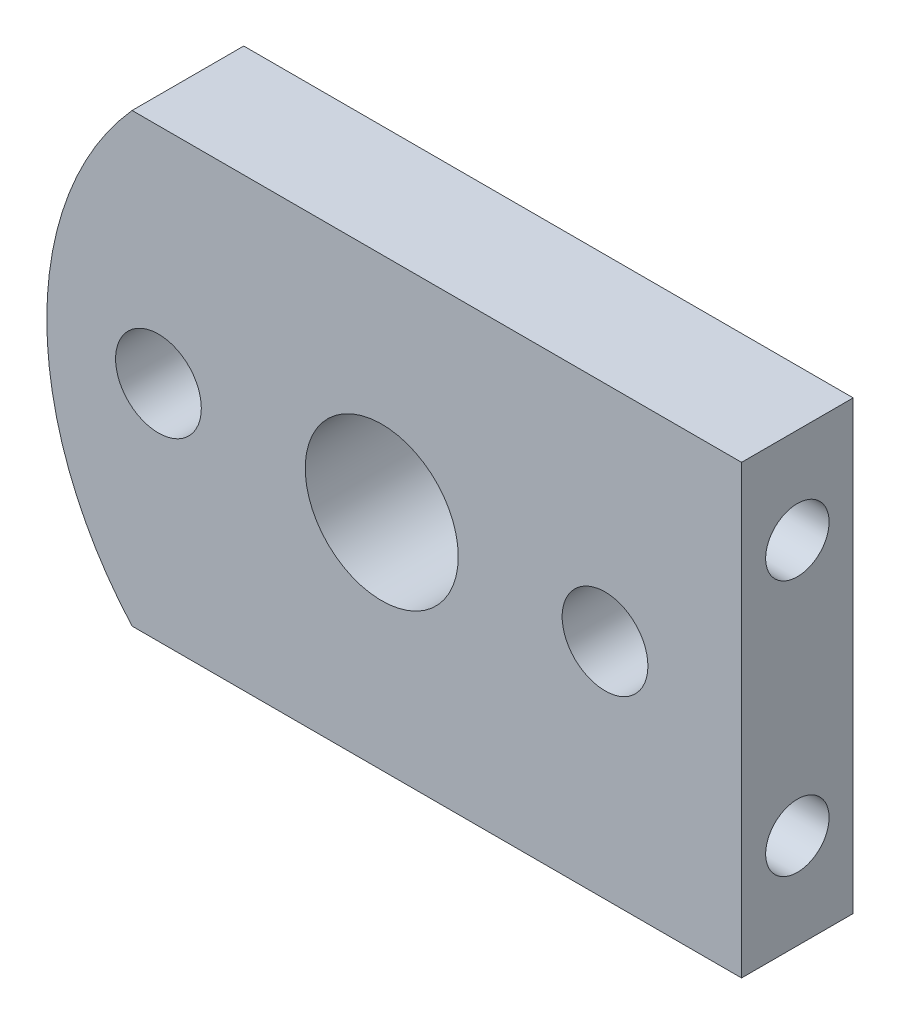
ISO-10303-21;
HEADER;
FILE_DESCRIPTION(('STEP AP214'),'2;1');
FILE_NAME('part.step','',(''),(''),'','','');
FILE_SCHEMA(('AUTOMOTIVE_DESIGN { 1 0 10303 214 1 1 1 1 }'));
ENDSEC;
DATA;
#1=APPLICATION_CONTEXT('core data for automotive mechanical design processes');
#2=APPLICATION_PROTOCOL_DEFINITION('international standard','automotive_design',2000,#1);
#3=PRODUCT_CONTEXT('',#1,'mechanical');
#4=PRODUCT('Part','Part','',(#3));
#5=PRODUCT_RELATED_PRODUCT_CATEGORY('part','',(#4));
#6=PRODUCT_DEFINITION_FORMATION('','',#4);
#7=PRODUCT_DEFINITION_CONTEXT('part definition',#1,'design');
#8=PRODUCT_DEFINITION('design','',#6,#7);
#9=PRODUCT_DEFINITION_SHAPE('','',#8);
#10=(LENGTH_UNIT() NAMED_UNIT(*) SI_UNIT(.MILLI.,.METRE.));
#11=(NAMED_UNIT(*) PLANE_ANGLE_UNIT() SI_UNIT($,.RADIAN.));
#12=(NAMED_UNIT(*) SI_UNIT($,.STERADIAN.) SOLID_ANGLE_UNIT());
#13=UNCERTAINTY_MEASURE_WITH_UNIT(LENGTH_MEASURE(1.E-05),#10,'distance_accuracy_value','');
#14=(GEOMETRIC_REPRESENTATION_CONTEXT(3) GLOBAL_UNCERTAINTY_ASSIGNED_CONTEXT((#13)) GLOBAL_UNIT_ASSIGNED_CONTEXT((#10,
#11,#12)) REPRESENTATION_CONTEXT('',''));
#15=CARTESIAN_POINT('',(0.,0.,0.));
#16=DIRECTION('',(0.,0.,1.));
#17=DIRECTION('',(1.,0.,0.));
#18=AXIS2_PLACEMENT_3D('',#15,#16,#17);
#19=CARTESIAN_POINT('',(44.45,0.,4.7625));
#20=DIRECTION('',(-1.,0.,0.));
#21=DIRECTION('',(0.,0.,1.));
#22=AXIS2_PLACEMENT_3D('',#19,#20,#21);
#23=PLANE('',#22);
#24=CARTESIAN_POINT('',(44.45,15.7733999999998,2.38125));
#25=DIRECTION('',(1.,0.,0.));
#26=DIRECTION('',(0.,0.,-1.));
#27=AXIS2_PLACEMENT_3D('',#24,#25,#26);
#28=CIRCLE('',#27,1.35254999999999);
#29=CARTESIAN_POINT('',(44.45,15.7733999999998,1.02870000000001));
#30=VERTEX_POINT('',#29);
#31=EDGE_CURVE('E96',#30,#30,#28,.T.);
#32=ORIENTED_EDGE('',*,*,#31,.F.);
#33=EDGE_LOOP('',(#32));
#34=FACE_BOUND('',#33,.T.);
#35=CARTESIAN_POINT('',(44.45,4.85139999999978,2.38125));
#36=DIRECTION('',(1.,0.,0.));
#37=DIRECTION('',(0.,0.,-1.));
#38=AXIS2_PLACEMENT_3D('',#35,#36,#37);
#39=CIRCLE('',#38,1.35254999999999);
#40=CARTESIAN_POINT('',(44.45,4.85139999999978,1.02870000000001));
#41=VERTEX_POINT('',#40);
#42=EDGE_CURVE('E95',#41,#41,#39,.T.);
#43=ORIENTED_EDGE('',*,*,#42,.F.);
#44=EDGE_LOOP('',(#43));
#45=FACE_BOUND('',#44,.T.);
#46=DIRECTION('',(0.,1.,0.));
#47=VECTOR('',#46,1.);
#48=CARTESIAN_POINT('',(44.45,0.,0.));
#49=LINE('',#48,#47);
#50=CARTESIAN_POINT('',(44.45,0.787399999999777,0.));
#51=VERTEX_POINT('',#50);
#52=CARTESIAN_POINT('',(44.45,19.8373999999998,0.));
#53=VERTEX_POINT('',#52);
#54=EDGE_CURVE('E37',#51,#53,#49,.T.);
#55=ORIENTED_EDGE('',*,*,#54,.T.);
#56=DIRECTION('',(0.,0.,1.));
#57=VECTOR('',#56,1.);
#58=CARTESIAN_POINT('',(44.45,19.8373999999998,0.));
#59=LINE('',#58,#57);
#60=CARTESIAN_POINT('',(44.45,19.8373999999998,4.7625));
#61=VERTEX_POINT('',#60);
#62=EDGE_CURVE('E57',#53,#61,#59,.T.);
#63=ORIENTED_EDGE('',*,*,#62,.T.);
#64=DIRECTION('',(0.,1.,0.));
#65=VECTOR('',#64,1.);
#66=CARTESIAN_POINT('',(44.45,0.,4.7625));
#67=LINE('',#66,#65);
#68=CARTESIAN_POINT('',(44.45,0.787399999999777,4.7625));
#69=VERTEX_POINT('',#68);
#70=EDGE_CURVE('E11',#69,#61,#67,.T.);
#71=ORIENTED_EDGE('',*,*,#70,.F.);
#72=DIRECTION('',(0.,0.,1.));
#73=VECTOR('',#72,1.);
#74=CARTESIAN_POINT('',(44.45,0.787399999999777,0.));
#75=LINE('',#74,#73);
#76=EDGE_CURVE('E111',#51,#69,#75,.T.);
#77=ORIENTED_EDGE('',*,*,#76,.F.);
#78=EDGE_LOOP('',(#55,#63,#71,#77));
#79=FACE_BOUND('',#78,.T.);
#80=ADVANCED_FACE('F34',(#34,#45,#79),#23,.F.);
#81=CARTESIAN_POINT('',(0.,0.,4.7625));
#82=DIRECTION('',(0.,0.,-1.));
#83=DIRECTION('',(-1.,0.,0.));
#84=AXIS2_PLACEMENT_3D('',#81,#82,#83);
#85=PLANE('',#84);
#86=CARTESIAN_POINT('',(38.6265,10.3123999999998,4.7625));
#87=DIRECTION('',(0.,0.,1.));
#88=DIRECTION('',(1.,0.,0.));
#89=AXIS2_PLACEMENT_3D('',#86,#87,#88);
#90=CIRCLE('',#89,1.8288);
#91=CARTESIAN_POINT('',(40.4553,10.3123999999998,4.7625));
#92=VERTEX_POINT('',#91);
#93=EDGE_CURVE('E119',#92,#92,#90,.T.);
#94=ORIENTED_EDGE('',*,*,#93,.F.);
#95=EDGE_LOOP('',(#94));
#96=FACE_BOUND('',#95,.T.);
#97=CARTESIAN_POINT('',(19.5765,10.3123999999998,4.7625));
#98=DIRECTION('',(0.,0.,1.));
#99=DIRECTION('',(1.,0.,0.));
#100=AXIS2_PLACEMENT_3D('',#97,#98,#99);
#101=CIRCLE('',#100,1.8288);
#102=CARTESIAN_POINT('',(21.4053,10.3123999999998,4.7625));
#103=VERTEX_POINT('',#102);
#104=EDGE_CURVE('E130',#103,#103,#101,.T.);
#105=ORIENTED_EDGE('',*,*,#104,.F.);
#106=EDGE_LOOP('',(#105));
#107=FACE_BOUND('',#106,.T.);
#108=CARTESIAN_POINT('',(29.1015,10.3123999999998,4.7625));
#109=DIRECTION('',(0.,0.,1.));
#110=DIRECTION('',(1.,0.,0.));
#111=AXIS2_PLACEMENT_3D('',#108,#109,#110);
#112=CIRCLE('',#111,3.2639);
#113=CARTESIAN_POINT('',(32.3654,10.3123999999998,4.7625));
#114=VERTEX_POINT('',#113);
#115=EDGE_CURVE('E136',#114,#114,#112,.T.);
#116=ORIENTED_EDGE('',*,*,#115,.F.);
#117=EDGE_LOOP('',(#116));
#118=FACE_BOUND('',#117,.T.);
#119=ORIENTED_EDGE('',*,*,#70,.T.);
#120=DIRECTION('',(1.,0.,0.));
#121=VECTOR('',#120,1.);
#122=CARTESIAN_POINT('',(18.4522262571573,19.8373999999998,4.7625));
#123=LINE('',#122,#121);
#124=CARTESIAN_POINT('',(18.4522262571573,19.8373999999998,4.7625));
#125=VERTEX_POINT('',#124);
#126=EDGE_CURVE('E73',#125,#61,#123,.T.);
#127=ORIENTED_EDGE('',*,*,#126,.F.);
#128=CARTESIAN_POINT('',(29.1015,10.3123999999998,4.7625));
#129=DIRECTION('',(0.,0.,-1.));
#130=DIRECTION('',(1.,0.,0.));
#131=AXIS2_PLACEMENT_3D('',#128,#129,#130);
#132=CIRCLE('',#131,14.2875);
#133=CARTESIAN_POINT('',(18.4522262571573,0.787399999999778,4.7625));
#134=VERTEX_POINT('',#133);
#135=EDGE_CURVE('E114',#134,#125,#132,.T.);
#136=ORIENTED_EDGE('',*,*,#135,.F.);
#137=DIRECTION('',(-1.,0.,0.));
#138=VECTOR('',#137,1.);
#139=CARTESIAN_POINT('',(18.4522262571573,0.787399999999776,4.7625));
#140=LINE('',#139,#138);
#141=EDGE_CURVE('E106',#69,#134,#140,.T.);
#142=ORIENTED_EDGE('',*,*,#141,.F.);
#143=EDGE_LOOP('',(#119,#127,#136,#142));
#144=FACE_BOUND('',#143,.T.);
#145=ADVANCED_FACE('F155',(#96,#107,#118,#144),#85,.F.);
#146=CARTESIAN_POINT('',(0.,0.,0.));
#147=DIRECTION('',(0.,0.,-1.));
#148=DIRECTION('',(-1.,0.,0.));
#149=AXIS2_PLACEMENT_3D('',#146,#147,#148);
#150=PLANE('',#149);
#151=DIRECTION('',(1.,0.,0.));
#152=VECTOR('',#151,1.);
#153=CARTESIAN_POINT('',(18.4522262571573,19.8373999999998,0.));
#154=LINE('',#153,#152);
#155=CARTESIAN_POINT('',(18.4522262571573,19.8373999999998,0.));
#156=VERTEX_POINT('',#155);
#157=EDGE_CURVE('E109',#156,#53,#154,.T.);
#158=ORIENTED_EDGE('',*,*,#157,.T.);
#159=ORIENTED_EDGE('',*,*,#54,.F.);
#160=DIRECTION('',(-1.,0.,0.));
#161=VECTOR('',#160,1.);
#162=CARTESIAN_POINT('',(18.4522262571573,0.787399999999776,0.));
#163=LINE('',#162,#161);
#164=CARTESIAN_POINT('',(18.4522262571573,0.787399999999776,0.));
#165=VERTEX_POINT('',#164);
#166=EDGE_CURVE('E77',#51,#165,#163,.T.);
#167=ORIENTED_EDGE('',*,*,#166,.T.);
#168=CARTESIAN_POINT('',(29.1015,10.3123999999998,0.));
#169=DIRECTION('',(0.,0.,-1.));
#170=DIRECTION('',(1.,0.,0.));
#171=AXIS2_PLACEMENT_3D('',#168,#169,#170);
#172=CIRCLE('',#171,14.2875);
#173=EDGE_CURVE('E48',#165,#156,#172,.T.);
#174=ORIENTED_EDGE('',*,*,#173,.T.);
#175=EDGE_LOOP('',(#158,#159,#167,#174));
#176=FACE_BOUND('',#175,.T.);
#177=CARTESIAN_POINT('',(38.6265,10.3123999999998,0.));
#178=DIRECTION('',(0.,0.,1.));
#179=DIRECTION('',(1.,0.,0.));
#180=AXIS2_PLACEMENT_3D('',#177,#178,#179);
#181=CIRCLE('',#180,1.8288);
#182=CARTESIAN_POINT('',(40.4553,10.3123999999998,0.));
#183=VERTEX_POINT('',#182);
#184=EDGE_CURVE('E127',#183,#183,#181,.T.);
#185=ORIENTED_EDGE('',*,*,#184,.T.);
#186=EDGE_LOOP('',(#185));
#187=FACE_BOUND('',#186,.T.);
#188=CARTESIAN_POINT('',(19.5765,10.3123999999998,0.));
#189=DIRECTION('',(0.,0.,1.));
#190=DIRECTION('',(1.,0.,0.));
#191=AXIS2_PLACEMENT_3D('',#188,#189,#190);
#192=CIRCLE('',#191,1.8288);
#193=CARTESIAN_POINT('',(21.4053,10.3123999999998,0.));
#194=VERTEX_POINT('',#193);
#195=EDGE_CURVE('E133',#194,#194,#192,.T.);
#196=ORIENTED_EDGE('',*,*,#195,.T.);
#197=EDGE_LOOP('',(#196));
#198=FACE_BOUND('',#197,.T.);
#199=CARTESIAN_POINT('',(29.1015,10.3123999999998,0.));
#200=DIRECTION('',(0.,0.,1.));
#201=DIRECTION('',(1.,0.,0.));
#202=AXIS2_PLACEMENT_3D('',#199,#200,#201);
#203=CIRCLE('',#202,3.2639);
#204=CARTESIAN_POINT('',(32.3654,10.3123999999998,0.));
#205=VERTEX_POINT('',#204);
#206=EDGE_CURVE('E139',#205,#205,#203,.T.);
#207=ORIENTED_EDGE('',*,*,#206,.T.);
#208=EDGE_LOOP('',(#207));
#209=FACE_BOUND('',#208,.T.);
#210=ADVANCED_FACE('F148',(#176,#187,#198,#209),#150,.T.);
#211=CARTESIAN_POINT('',(29.1015,10.3123999999998,4.7625));
#212=DIRECTION('',(0.,0.,1.));
#213=DIRECTION('',(1.,0.,0.));
#214=AXIS2_PLACEMENT_3D('',#211,#212,#213);
#215=CYLINDRICAL_SURFACE('',#214,3.2639);
#216=ORIENTED_EDGE('',*,*,#206,.F.);
#217=EDGE_LOOP('',(#216));
#218=FACE_BOUND('',#217,.T.);
#219=ORIENTED_EDGE('',*,*,#115,.T.);
#220=EDGE_LOOP('',(#219));
#221=FACE_BOUND('',#220,.T.);
#222=ADVANCED_FACE('F200',(#218,#221),#215,.F.);
#223=CARTESIAN_POINT('',(19.5765,10.3123999999998,4.7625));
#224=DIRECTION('',(0.,0.,1.));
#225=DIRECTION('',(1.,0.,0.));
#226=AXIS2_PLACEMENT_3D('',#223,#224,#225);
#227=CYLINDRICAL_SURFACE('',#226,1.8288);
#228=ORIENTED_EDGE('',*,*,#195,.F.);
#229=EDGE_LOOP('',(#228));
#230=FACE_BOUND('',#229,.T.);
#231=ORIENTED_EDGE('',*,*,#104,.T.);
#232=EDGE_LOOP('',(#231));
#233=FACE_BOUND('',#232,.T.);
#234=ADVANCED_FACE('F195',(#230,#233),#227,.F.);
#235=CARTESIAN_POINT('',(38.6265,10.3123999999998,4.7625));
#236=DIRECTION('',(0.,0.,1.));
#237=DIRECTION('',(1.,0.,0.));
#238=AXIS2_PLACEMENT_3D('',#235,#236,#237);
#239=CYLINDRICAL_SURFACE('',#238,1.8288);
#240=ORIENTED_EDGE('',*,*,#184,.F.);
#241=EDGE_LOOP('',(#240));
#242=FACE_BOUND('',#241,.T.);
#243=ORIENTED_EDGE('',*,*,#93,.T.);
#244=EDGE_LOOP('',(#243));
#245=FACE_BOUND('',#244,.T.);
#246=ADVANCED_FACE('F191',(#242,#245),#239,.F.);
#247=CARTESIAN_POINT('',(18.4522262571573,19.8373999999998,0.));
#248=DIRECTION('',(0.,-1.,0.));
#249=DIRECTION('',(0.,0.,-1.));
#250=AXIS2_PLACEMENT_3D('',#247,#248,#249);
#251=PLANE('',#250);
#252=ORIENTED_EDGE('',*,*,#126,.T.);
#253=ORIENTED_EDGE('',*,*,#62,.F.);
#254=ORIENTED_EDGE('',*,*,#157,.F.);
#255=DIRECTION('',(0.,0.,1.));
#256=VECTOR('',#255,1.);
#257=CARTESIAN_POINT('',(18.4522262571573,19.8373999999998,0.));
#258=LINE('',#257,#256);
#259=EDGE_CURVE('E120',#156,#125,#258,.T.);
#260=ORIENTED_EDGE('',*,*,#259,.T.);
#261=EDGE_LOOP('',(#252,#253,#254,#260));
#262=FACE_BOUND('',#261,.T.);
#263=ADVANCED_FACE('F150',(#262),#251,.F.);
#264=CARTESIAN_POINT('',(29.1015,10.3123999999998,0.));
#265=DIRECTION('',(0.,0.,1.));
#266=DIRECTION('',(1.,0.,0.));
#267=AXIS2_PLACEMENT_3D('',#264,#265,#266);
#268=CYLINDRICAL_SURFACE('',#267,14.2875);
#269=ORIENTED_EDGE('',*,*,#135,.T.);
#270=ORIENTED_EDGE('',*,*,#259,.F.);
#271=ORIENTED_EDGE('',*,*,#173,.F.);
#272=DIRECTION('',(0.,0.,1.));
#273=VECTOR('',#272,1.);
#274=CARTESIAN_POINT('',(18.4522262571573,0.787399999999778,0.));
#275=LINE('',#274,#273);
#276=EDGE_CURVE('E122',#165,#134,#275,.T.);
#277=ORIENTED_EDGE('',*,*,#276,.T.);
#278=EDGE_LOOP('',(#269,#270,#271,#277));
#279=FACE_BOUND('',#278,.T.);
#280=ADVANCED_FACE('F152',(#279),#268,.T.);
#281=CARTESIAN_POINT('',(18.4522262571573,0.787399999999776,0.));
#282=DIRECTION('',(0.,1.,0.));
#283=DIRECTION('',(-1.,0.,0.));
#284=AXIS2_PLACEMENT_3D('',#281,#282,#283);
#285=PLANE('',#284);
#286=ORIENTED_EDGE('',*,*,#141,.T.);
#287=ORIENTED_EDGE('',*,*,#276,.F.);
#288=ORIENTED_EDGE('',*,*,#166,.F.);
#289=ORIENTED_EDGE('',*,*,#76,.T.);
#290=EDGE_LOOP('',(#286,#287,#288,#289));
#291=FACE_BOUND('',#290,.T.);
#292=ADVANCED_FACE('F156',(#291),#285,.F.);
#293=CARTESIAN_POINT('',(31.75,4.85139999999978,2.38125));
#294=DIRECTION('',(1.,0.,0.));
#295=DIRECTION('',(0.,0.,-1.));
#296=AXIS2_PLACEMENT_3D('',#293,#294,#295);
#297=CONICAL_SURFACE('',#296,1.35255,1.02974425867665);
#298=CARTESIAN_POINT('',(30.9373059697343,4.85139999999977,2.38125));
#299=VERTEX_POINT('',#298);
#300=VERTEX_LOOP('',#299);
#301=FACE_BOUND('',#300,.T.);
#302=CARTESIAN_POINT('',(31.75,4.85139999999978,2.38125));
#303=DIRECTION('',(1.,0.,0.));
#304=DIRECTION('',(0.,0.,-1.));
#305=AXIS2_PLACEMENT_3D('',#302,#303,#304);
#306=CIRCLE('',#305,1.35255);
#307=CARTESIAN_POINT('',(31.75,4.85139999999978,1.0287));
#308=VERTEX_POINT('',#307);
#309=EDGE_CURVE('E99',#308,#308,#306,.T.);
#310=ORIENTED_EDGE('',*,*,#309,.T.);
#311=EDGE_LOOP('',(#310));
#312=FACE_BOUND('',#311,.T.);
#313=ADVANCED_FACE('F158',(#301,#312),#297,.F.);
#314=CARTESIAN_POINT('',(44.45,4.85139999999978,2.38125));
#315=DIRECTION('',(1.,0.,0.));
#316=DIRECTION('',(0.,0.,-1.));
#317=AXIS2_PLACEMENT_3D('',#314,#315,#316);
#318=CYLINDRICAL_SURFACE('',#317,1.35254999999999);
#319=ORIENTED_EDGE('',*,*,#309,.F.);
#320=EDGE_LOOP('',(#319));
#321=FACE_BOUND('',#320,.T.);
#322=ORIENTED_EDGE('',*,*,#42,.T.);
#323=EDGE_LOOP('',(#322));
#324=FACE_BOUND('',#323,.T.);
#325=ADVANCED_FACE('F89',(#321,#324),#318,.F.);
#326=CARTESIAN_POINT('',(31.75,15.7733999999998,2.38125));
#327=DIRECTION('',(1.,0.,0.));
#328=DIRECTION('',(0.,0.,-1.));
#329=AXIS2_PLACEMENT_3D('',#326,#327,#328);
#330=CONICAL_SURFACE('',#329,1.35255,1.02974425867665);
#331=CARTESIAN_POINT('',(30.9373059697343,15.7733999999998,2.38125));
#332=VERTEX_POINT('',#331);
#333=VERTEX_LOOP('',#332);
#334=FACE_BOUND('',#333,.T.);
#335=CARTESIAN_POINT('',(31.75,15.7733999999998,2.38125));
#336=DIRECTION('',(1.,0.,0.));
#337=DIRECTION('',(0.,0.,-1.));
#338=AXIS2_PLACEMENT_3D('',#335,#336,#337);
#339=CIRCLE('',#338,1.35255);
#340=CARTESIAN_POINT('',(31.75,15.7733999999998,1.0287));
#341=VERTEX_POINT('',#340);
#342=EDGE_CURVE('E93',#341,#341,#339,.T.);
#343=ORIENTED_EDGE('',*,*,#342,.T.);
#344=EDGE_LOOP('',(#343));
#345=FACE_BOUND('',#344,.T.);
#346=ADVANCED_FACE('F85',(#334,#345),#330,.F.);
#347=CARTESIAN_POINT('',(44.45,15.7733999999998,2.38125));
#348=DIRECTION('',(1.,0.,0.));
#349=DIRECTION('',(0.,0.,-1.));
#350=AXIS2_PLACEMENT_3D('',#347,#348,#349);
#351=CYLINDRICAL_SURFACE('',#350,1.35254999999999);
#352=ORIENTED_EDGE('',*,*,#342,.F.);
#353=EDGE_LOOP('',(#352));
#354=FACE_BOUND('',#353,.T.);
#355=ORIENTED_EDGE('',*,*,#31,.T.);
#356=EDGE_LOOP('',(#355));
#357=FACE_BOUND('',#356,.T.);
#358=ADVANCED_FACE('F88',(#354,#357),#351,.F.);
#359=CLOSED_SHELL('',(#80,#145,#210,#222,#234,#246,#263,#280,#292,#313,#325,#346,#358));
#360=MANIFOLD_SOLID_BREP('B2',#359);
#361=ADVANCED_BREP_SHAPE_REPRESENTATION('',(#18,#360),#14);
#362=SHAPE_DEFINITION_REPRESENTATION(#9,#361);
ENDSEC;
END-ISO-10303-21;
